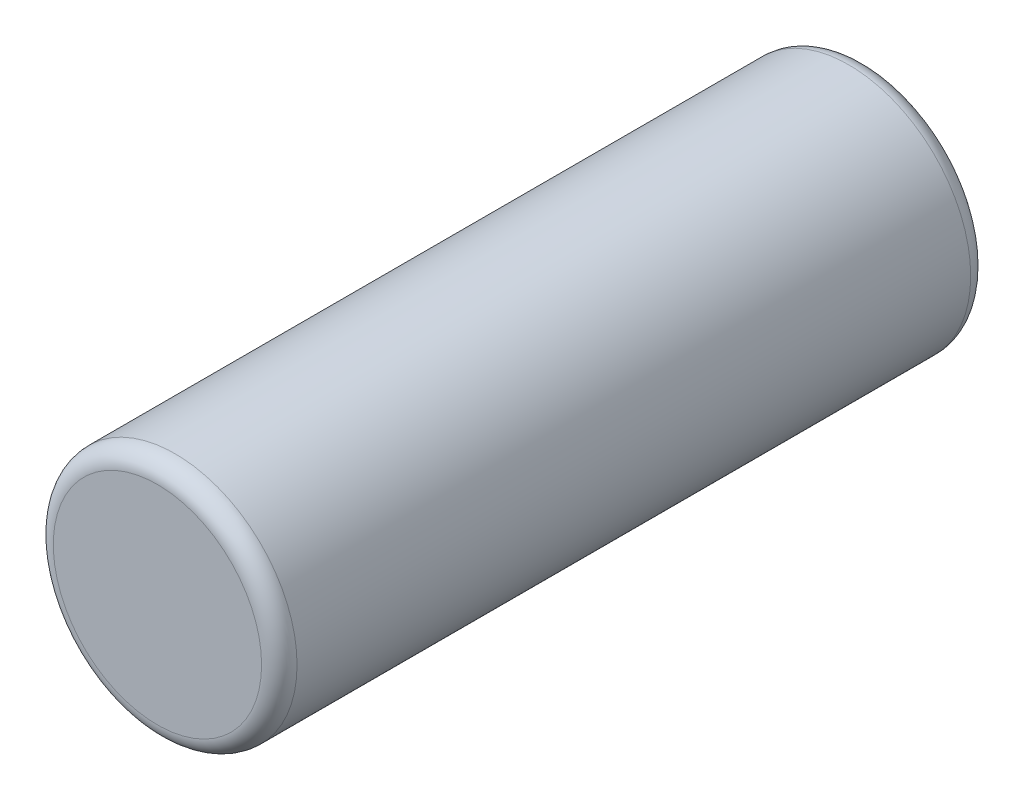
ISO-10303-21;
HEADER;
FILE_DESCRIPTION(('STEP AP214'),'2;1');
FILE_NAME('part.step','',(''),(''),'','','');
FILE_SCHEMA(('AUTOMOTIVE_DESIGN { 1 0 10303 214 1 1 1 1 }'));
ENDSEC;
DATA;
#1=APPLICATION_CONTEXT('core data for automotive mechanical design processes');
#2=APPLICATION_PROTOCOL_DEFINITION('international standard','automotive_design',2000,#1);
#3=PRODUCT_CONTEXT('',#1,'mechanical');
#4=PRODUCT('Part','Part','',(#3));
#5=PRODUCT_RELATED_PRODUCT_CATEGORY('part','',(#4));
#6=PRODUCT_DEFINITION_FORMATION('','',#4);
#7=PRODUCT_DEFINITION_CONTEXT('part definition',#1,'design');
#8=PRODUCT_DEFINITION('design','',#6,#7);
#9=PRODUCT_DEFINITION_SHAPE('','',#8);
#10=(LENGTH_UNIT() NAMED_UNIT(*) SI_UNIT(.MILLI.,.METRE.));
#11=(NAMED_UNIT(*) PLANE_ANGLE_UNIT() SI_UNIT($,.RADIAN.));
#12=(NAMED_UNIT(*) SI_UNIT($,.STERADIAN.) SOLID_ANGLE_UNIT());
#13=UNCERTAINTY_MEASURE_WITH_UNIT(LENGTH_MEASURE(1.E-05),#10,'distance_accuracy_value','');
#14=(GEOMETRIC_REPRESENTATION_CONTEXT(3) GLOBAL_UNCERTAINTY_ASSIGNED_CONTEXT((#13)) GLOBAL_UNIT_ASSIGNED_CONTEXT((#10,
#11,#12)) REPRESENTATION_CONTEXT('',''));
#15=CARTESIAN_POINT('',(0.,0.,0.));
#16=DIRECTION('',(0.,0.,1.));
#17=DIRECTION('',(1.,0.,0.));
#18=AXIS2_PLACEMENT_3D('',#15,#16,#17);
#19=CARTESIAN_POINT('',(0.,0.,8.));
#20=DIRECTION('',(0.,0.,-1.));
#21=DIRECTION('',(-1.,0.,0.));
#22=AXIS2_PLACEMENT_3D('',#19,#20,#21);
#23=CYLINDRICAL_SURFACE('',#22,1.375);
#24=CARTESIAN_POINT('',(0.,0.,7.8));
#25=DIRECTION('',(0.,0.,1.));
#26=DIRECTION('',(1.,0.,0.));
#27=AXIS2_PLACEMENT_3D('',#24,#25,#26);
#28=CIRCLE('',#27,1.375);
#29=CARTESIAN_POINT('',(1.375,0.,7.8));
#30=VERTEX_POINT('',#29);
#31=EDGE_CURVE('E38',#30,#30,#28,.F.);
#32=ORIENTED_EDGE('',*,*,#31,.T.);
#33=EDGE_LOOP('',(#32));
#34=FACE_BOUND('',#33,.T.);
#35=CARTESIAN_POINT('',(0.,0.,0.2));
#36=DIRECTION('',(0.,0.,1.));
#37=DIRECTION('',(1.,0.,0.));
#38=AXIS2_PLACEMENT_3D('',#35,#36,#37);
#39=CIRCLE('',#38,1.375);
#40=CARTESIAN_POINT('',(1.375,0.,0.2));
#41=VERTEX_POINT('',#40);
#42=EDGE_CURVE('E42',#41,#41,#39,.T.);
#43=ORIENTED_EDGE('',*,*,#42,.T.);
#44=EDGE_LOOP('',(#43));
#45=FACE_BOUND('',#44,.T.);
#46=ADVANCED_FACE('F31',(#34,#45),#23,.T.);
#47=CARTESIAN_POINT('',(0.,0.,8.));
#48=DIRECTION('',(0.,0.,1.));
#49=DIRECTION('',(1.,0.,0.));
#50=AXIS2_PLACEMENT_3D('',#47,#48,#49);
#51=PLANE('',#50);
#52=CARTESIAN_POINT('',(0.,0.,8.));
#53=DIRECTION('',(0.,0.,1.));
#54=DIRECTION('',(1.,0.,0.));
#55=AXIS2_PLACEMENT_3D('',#52,#53,#54);
#56=CIRCLE('',#55,1.175);
#57=CARTESIAN_POINT('',(1.175,0.,8.));
#58=VERTEX_POINT('',#57);
#59=EDGE_CURVE('E46',#58,#58,#56,.T.);
#60=ORIENTED_EDGE('',*,*,#59,.T.);
#61=EDGE_LOOP('',(#60));
#62=FACE_BOUND('',#61,.T.);
#63=ADVANCED_FACE('F52',(#62),#51,.T.);
#64=CARTESIAN_POINT('',(0.,0.,0.));
#65=DIRECTION('',(0.,0.,1.));
#66=DIRECTION('',(1.,0.,0.));
#67=AXIS2_PLACEMENT_3D('',#64,#65,#66);
#68=PLANE('',#67);
#69=CARTESIAN_POINT('',(0.,0.,0.));
#70=DIRECTION('',(0.,0.,1.));
#71=DIRECTION('',(1.,0.,0.));
#72=AXIS2_PLACEMENT_3D('',#69,#70,#71);
#73=CIRCLE('',#72,1.175);
#74=CARTESIAN_POINT('',(1.175,0.,0.));
#75=VERTEX_POINT('',#74);
#76=EDGE_CURVE('E10',#75,#75,#73,.F.);
#77=ORIENTED_EDGE('',*,*,#76,.T.);
#78=EDGE_LOOP('',(#77));
#79=FACE_BOUND('',#78,.T.);
#80=ADVANCED_FACE('F56',(#79),#68,.F.);
#81=CARTESIAN_POINT('',(0.,0.,7.8));
#82=DIRECTION('',(0.,0.,1.));
#83=DIRECTION('',(1.,0.,0.));
#84=AXIS2_PLACEMENT_3D('',#81,#82,#83);
#85=TOROIDAL_SURFACE('',#84,1.175,0.2);
#86=ORIENTED_EDGE('',*,*,#31,.F.);
#87=EDGE_LOOP('',(#86));
#88=FACE_BOUND('',#87,.T.);
#89=ORIENTED_EDGE('',*,*,#59,.F.);
#90=EDGE_LOOP('',(#89));
#91=FACE_BOUND('',#90,.T.);
#92=ADVANCED_FACE('F54',(#88,#91),#85,.T.);
#93=CARTESIAN_POINT('',(0.,0.,0.2));
#94=DIRECTION('',(0.,0.,1.));
#95=DIRECTION('',(1.,0.,0.));
#96=AXIS2_PLACEMENT_3D('',#93,#94,#95);
#97=TOROIDAL_SURFACE('',#96,1.175,0.2);
#98=ORIENTED_EDGE('',*,*,#76,.F.);
#99=EDGE_LOOP('',(#98));
#100=FACE_BOUND('',#99,.T.);
#101=ORIENTED_EDGE('',*,*,#42,.F.);
#102=EDGE_LOOP('',(#101));
#103=FACE_BOUND('',#102,.T.);
#104=ADVANCED_FACE('F33',(#100,#103),#97,.T.);
#105=CLOSED_SHELL('',(#46,#63,#80,#92,#104));
#106=MANIFOLD_SOLID_BREP('B2',#105);
#107=ADVANCED_BREP_SHAPE_REPRESENTATION('',(#18,#106),#14);
#108=SHAPE_DEFINITION_REPRESENTATION(#9,#107);
ENDSEC;
END-ISO-10303-21;
